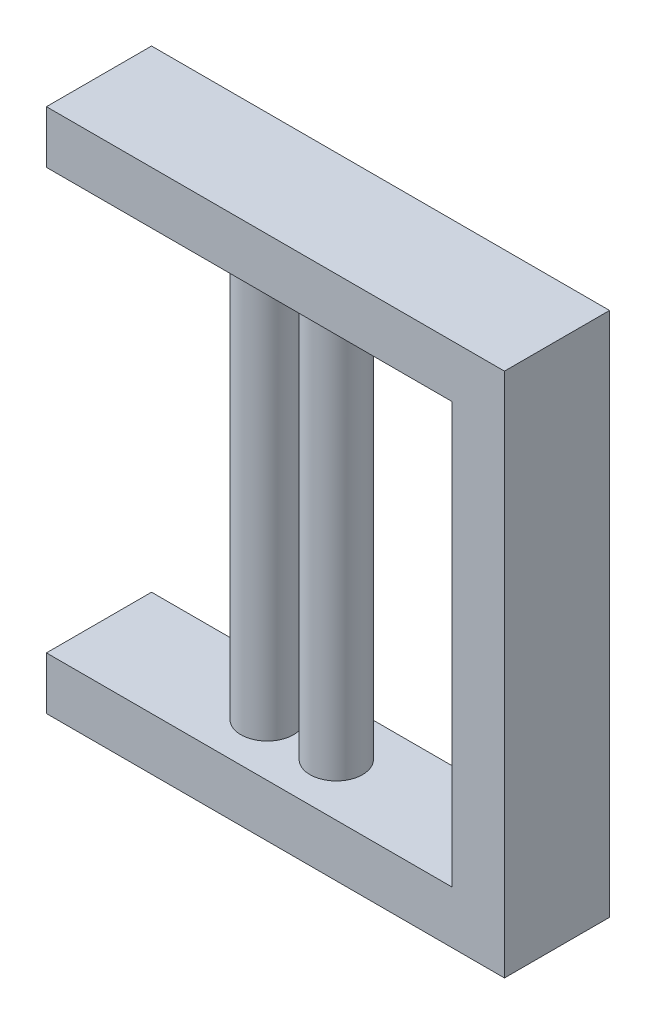
ISO-10303-21;
HEADER;
FILE_DESCRIPTION(('STEP AP214'),'2;1');
FILE_NAME('part.step','',(''),(''),'','','');
FILE_SCHEMA(('AUTOMOTIVE_DESIGN { 1 0 10303 214 1 1 1 1 }'));
ENDSEC;
DATA;
#1=APPLICATION_CONTEXT('core data for automotive mechanical design processes');
#2=APPLICATION_PROTOCOL_DEFINITION('international standard','automotive_design',2000,#1);
#3=PRODUCT_CONTEXT('',#1,'mechanical');
#4=PRODUCT('Part','Part','',(#3));
#5=PRODUCT_RELATED_PRODUCT_CATEGORY('part','',(#4));
#6=PRODUCT_DEFINITION_FORMATION('','',#4);
#7=PRODUCT_DEFINITION_CONTEXT('part definition',#1,'design');
#8=PRODUCT_DEFINITION('design','',#6,#7);
#9=PRODUCT_DEFINITION_SHAPE('','',#8);
#10=(LENGTH_UNIT() NAMED_UNIT(*) SI_UNIT(.MILLI.,.METRE.));
#11=(NAMED_UNIT(*) PLANE_ANGLE_UNIT() SI_UNIT($,.RADIAN.));
#12=(NAMED_UNIT(*) SI_UNIT($,.STERADIAN.) SOLID_ANGLE_UNIT());
#13=UNCERTAINTY_MEASURE_WITH_UNIT(LENGTH_MEASURE(1.E-05),#10,'distance_accuracy_value','');
#14=(GEOMETRIC_REPRESENTATION_CONTEXT(3) GLOBAL_UNCERTAINTY_ASSIGNED_CONTEXT((#13)) GLOBAL_UNIT_ASSIGNED_CONTEXT((#10,
#11,#12)) REPRESENTATION_CONTEXT('',''));
#15=CARTESIAN_POINT('',(0.,0.,0.));
#16=DIRECTION('',(0.,0.,1.));
#17=DIRECTION('',(1.,0.,0.));
#18=AXIS2_PLACEMENT_3D('',#15,#16,#17);
#19=CARTESIAN_POINT('',(97.9800475059383,101.6,25.4));
#20=DIRECTION('',(0.,1.,0.));
#21=DIRECTION('',(0.,0.,1.));
#22=AXIS2_PLACEMENT_3D('',#19,#20,#21);
#23=PLANE('',#22);
#24=CARTESIAN_POINT('',(40.6400277529691,101.6,12.7));
#25=DIRECTION('',(0.,1.,0.));
#26=DIRECTION('',(0.,0.,1.));
#27=AXIS2_PLACEMENT_3D('',#24,#25,#26);
#28=CIRCLE('',#27,6.35);
#29=CARTESIAN_POINT('',(40.6400277529691,101.6,19.05));
#30=VERTEX_POINT('',#29);
#31=EDGE_CURVE('E165',#30,#30,#28,.F.);
#32=ORIENTED_EDGE('',*,*,#31,.F.);
#33=EDGE_LOOP('',(#32));
#34=FACE_BOUND('',#33,.T.);
#35=DIRECTION('',(1.,0.,0.));
#36=VECTOR('',#35,1.);
#37=CARTESIAN_POINT('',(97.9800475059383,101.6,0.));
#38=LINE('',#37,#36);
#39=CARTESIAN_POINT('',(0.,101.6,0.));
#40=VERTEX_POINT('',#39);
#41=CARTESIAN_POINT('',(97.9800475059383,101.6,0.));
#42=VERTEX_POINT('',#41);
#43=EDGE_CURVE('E123',#40,#42,#38,.T.);
#44=ORIENTED_EDGE('',*,*,#43,.T.);
#45=DIRECTION('',(0.,0.,-1.));
#46=VECTOR('',#45,1.);
#47=CARTESIAN_POINT('',(97.9800475059383,101.6,25.4));
#48=LINE('',#47,#46);
#49=CARTESIAN_POINT('',(97.9800475059383,101.6,25.4));
#50=VERTEX_POINT('',#49);
#51=EDGE_CURVE('E120',#50,#42,#48,.T.);
#52=ORIENTED_EDGE('',*,*,#51,.F.);
#53=DIRECTION('',(1.,0.,0.));
#54=VECTOR('',#53,1.);
#55=CARTESIAN_POINT('',(97.9800475059383,101.6,25.4));
#56=LINE('',#55,#54);
#57=CARTESIAN_POINT('',(0.,101.6,25.4));
#58=VERTEX_POINT('',#57);
#59=EDGE_CURVE('E109',#58,#50,#56,.T.);
#60=ORIENTED_EDGE('',*,*,#59,.F.);
#61=DIRECTION('',(0.,0.,-1.));
#62=VECTOR('',#61,1.);
#63=CARTESIAN_POINT('',(0.,101.6,25.4));
#64=LINE('',#63,#62);
#65=EDGE_CURVE('E124',#58,#40,#64,.T.);
#66=ORIENTED_EDGE('',*,*,#65,.T.);
#67=EDGE_LOOP('',(#44,#52,#60,#66));
#68=FACE_BOUND('',#67,.T.);
#69=CARTESIAN_POINT('',(57.3400197529691,101.6,12.7));
#70=DIRECTION('',(0.,1.,0.));
#71=DIRECTION('',(0.,0.,1.));
#72=AXIS2_PLACEMENT_3D('',#69,#70,#71);
#73=CIRCLE('',#72,6.35000000000001);
#74=CARTESIAN_POINT('',(57.3400197529691,101.6,19.05));
#75=VERTEX_POINT('',#74);
#76=EDGE_CURVE('E11',#75,#75,#73,.F.);
#77=ORIENTED_EDGE('',*,*,#76,.F.);
#78=EDGE_LOOP('',(#77));
#79=FACE_BOUND('',#78,.T.);
#80=ADVANCED_FACE('F35',(#34,#68,#79),#23,.F.);
#81=CARTESIAN_POINT('',(0.,0.,25.4));
#82=DIRECTION('',(0.,-1.,0.));
#83=DIRECTION('',(0.,0.,-1.));
#84=AXIS2_PLACEMENT_3D('',#81,#82,#83);
#85=PLANE('',#84);
#86=CARTESIAN_POINT('',(40.6400277529691,0.,12.7));
#87=DIRECTION('',(0.,-1.,0.));
#88=DIRECTION('',(0.,0.,-1.));
#89=AXIS2_PLACEMENT_3D('',#86,#87,#88);
#90=CIRCLE('',#89,6.35);
#91=CARTESIAN_POINT('',(40.6400277529691,0.,6.35000000000001));
#92=VERTEX_POINT('',#91);
#93=EDGE_CURVE('E162',#92,#92,#90,.F.);
#94=ORIENTED_EDGE('',*,*,#93,.F.);
#95=EDGE_LOOP('',(#94));
#96=FACE_BOUND('',#95,.T.);
#97=DIRECTION('',(-1.,0.,0.));
#98=VECTOR('',#97,1.);
#99=CARTESIAN_POINT('',(0.,0.,0.));
#100=LINE('',#99,#98);
#101=CARTESIAN_POINT('',(97.9800475059383,0.,0.));
#102=VERTEX_POINT('',#101);
#103=CARTESIAN_POINT('',(0.,0.,0.));
#104=VERTEX_POINT('',#103);
#105=EDGE_CURVE('E87',#102,#104,#100,.T.);
#106=ORIENTED_EDGE('',*,*,#105,.T.);
#107=DIRECTION('',(0.,0.,-1.));
#108=VECTOR('',#107,1.);
#109=CARTESIAN_POINT('',(0.,0.,25.4));
#110=LINE('',#109,#108);
#111=CARTESIAN_POINT('',(0.,0.,25.4));
#112=VERTEX_POINT('',#111);
#113=EDGE_CURVE('E129',#112,#104,#110,.T.);
#114=ORIENTED_EDGE('',*,*,#113,.F.);
#115=DIRECTION('',(-1.,0.,0.));
#116=VECTOR('',#115,1.);
#117=CARTESIAN_POINT('',(0.,0.,25.4));
#118=LINE('',#117,#116);
#119=CARTESIAN_POINT('',(97.9800475059383,0.,25.4));
#120=VERTEX_POINT('',#119);
#121=EDGE_CURVE('E52',#120,#112,#118,.T.);
#122=ORIENTED_EDGE('',*,*,#121,.F.);
#123=DIRECTION('',(0.,0.,-1.));
#124=VECTOR('',#123,1.);
#125=CARTESIAN_POINT('',(97.9800475059383,0.,25.4));
#126=LINE('',#125,#124);
#127=EDGE_CURVE('E125',#120,#102,#126,.T.);
#128=ORIENTED_EDGE('',*,*,#127,.T.);
#129=EDGE_LOOP('',(#106,#114,#122,#128));
#130=FACE_BOUND('',#129,.T.);
#131=CARTESIAN_POINT('',(57.3400197529691,0.,12.7));
#132=DIRECTION('',(0.,-1.,0.));
#133=DIRECTION('',(0.,0.,-1.));
#134=AXIS2_PLACEMENT_3D('',#131,#132,#133);
#135=CIRCLE('',#134,6.35000000000001);
#136=CARTESIAN_POINT('',(57.3400197529691,0.,6.35));
#137=VERTEX_POINT('',#136);
#138=EDGE_CURVE('E44',#137,#137,#135,.F.);
#139=ORIENTED_EDGE('',*,*,#138,.F.);
#140=EDGE_LOOP('',(#139));
#141=FACE_BOUND('',#140,.T.);
#142=ADVANCED_FACE('F172',(#96,#130,#141),#85,.F.);
#143=CARTESIAN_POINT('',(0.,-12.7,25.4));
#144=DIRECTION('',(1.,0.,0.));
#145=DIRECTION('',(0.,0.,-1.));
#146=AXIS2_PLACEMENT_3D('',#143,#144,#145);
#147=PLANE('',#146);
#148=DIRECTION('',(0.,-1.,0.));
#149=VECTOR('',#148,1.);
#150=CARTESIAN_POINT('',(0.,-12.7,0.));
#151=LINE('',#150,#149);
#152=CARTESIAN_POINT('',(0.,-12.7,0.));
#153=VERTEX_POINT('',#152);
#154=EDGE_CURVE('E133',#104,#153,#151,.T.);
#155=ORIENTED_EDGE('',*,*,#154,.T.);
#156=DIRECTION('',(0.,0.,-1.));
#157=VECTOR('',#156,1.);
#158=CARTESIAN_POINT('',(0.,-12.7,25.4));
#159=LINE('',#158,#157);
#160=CARTESIAN_POINT('',(0.,-12.7,25.4));
#161=VERTEX_POINT('',#160);
#162=EDGE_CURVE('E160',#161,#153,#159,.T.);
#163=ORIENTED_EDGE('',*,*,#162,.F.);
#164=DIRECTION('',(0.,-1.,0.));
#165=VECTOR('',#164,1.);
#166=CARTESIAN_POINT('',(0.,-12.7,25.4));
#167=LINE('',#166,#165);
#168=EDGE_CURVE('E147',#112,#161,#167,.T.);
#169=ORIENTED_EDGE('',*,*,#168,.F.);
#170=ORIENTED_EDGE('',*,*,#113,.T.);
#171=EDGE_LOOP('',(#155,#163,#169,#170));
#172=FACE_BOUND('',#171,.T.);
#173=ADVANCED_FACE('F37',(#172),#147,.F.);
#174=CARTESIAN_POINT('',(110.680047505938,-12.7,25.4));
#175=DIRECTION('',(0.,1.,0.));
#176=DIRECTION('',(-1.,0.,0.));
#177=AXIS2_PLACEMENT_3D('',#174,#175,#176);
#178=PLANE('',#177);
#179=DIRECTION('',(1.,0.,0.));
#180=VECTOR('',#179,1.);
#181=CARTESIAN_POINT('',(110.680047505938,-12.7,0.));
#182=LINE('',#181,#180);
#183=CARTESIAN_POINT('',(110.680047505938,-12.7,0.));
#184=VERTEX_POINT('',#183);
#185=EDGE_CURVE('E136',#153,#184,#182,.T.);
#186=ORIENTED_EDGE('',*,*,#185,.T.);
#187=DIRECTION('',(0.,0.,-1.));
#188=VECTOR('',#187,1.);
#189=CARTESIAN_POINT('',(110.680047505938,-12.7,25.4));
#190=LINE('',#189,#188);
#191=CARTESIAN_POINT('',(110.680047505938,-12.7,25.4));
#192=VERTEX_POINT('',#191);
#193=EDGE_CURVE('E157',#192,#184,#190,.T.);
#194=ORIENTED_EDGE('',*,*,#193,.F.);
#195=DIRECTION('',(1.,0.,0.));
#196=VECTOR('',#195,1.);
#197=CARTESIAN_POINT('',(110.680047505938,-12.7,25.4));
#198=LINE('',#197,#196);
#199=EDGE_CURVE('E96',#161,#192,#198,.T.);
#200=ORIENTED_EDGE('',*,*,#199,.F.);
#201=ORIENTED_EDGE('',*,*,#162,.T.);
#202=EDGE_LOOP('',(#186,#194,#200,#201));
#203=FACE_BOUND('',#202,.T.);
#204=ADVANCED_FACE('F180',(#203),#178,.F.);
#205=CARTESIAN_POINT('',(110.680047505938,114.3,25.4));
#206=DIRECTION('',(-1.,0.,0.));
#207=DIRECTION('',(0.,-1.,0.));
#208=AXIS2_PLACEMENT_3D('',#205,#206,#207);
#209=PLANE('',#208);
#210=DIRECTION('',(0.,1.,0.));
#211=VECTOR('',#210,1.);
#212=CARTESIAN_POINT('',(110.680047505938,114.3,0.));
#213=LINE('',#212,#211);
#214=CARTESIAN_POINT('',(110.680047505938,114.3,0.));
#215=VERTEX_POINT('',#214);
#216=EDGE_CURVE('E138',#184,#215,#213,.T.);
#217=ORIENTED_EDGE('',*,*,#216,.T.);
#218=DIRECTION('',(0.,0.,-1.));
#219=VECTOR('',#218,1.);
#220=CARTESIAN_POINT('',(110.680047505938,114.3,25.4));
#221=LINE('',#220,#219);
#222=CARTESIAN_POINT('',(110.680047505938,114.3,25.4));
#223=VERTEX_POINT('',#222);
#224=EDGE_CURVE('E154',#223,#215,#221,.T.);
#225=ORIENTED_EDGE('',*,*,#224,.F.);
#226=DIRECTION('',(0.,1.,0.));
#227=VECTOR('',#226,1.);
#228=CARTESIAN_POINT('',(110.680047505938,114.3,25.4));
#229=LINE('',#228,#227);
#230=EDGE_CURVE('E211',#192,#223,#229,.T.);
#231=ORIENTED_EDGE('',*,*,#230,.F.);
#232=ORIENTED_EDGE('',*,*,#193,.T.);
#233=EDGE_LOOP('',(#217,#225,#231,#232));
#234=FACE_BOUND('',#233,.T.);
#235=ADVANCED_FACE('F198',(#234),#209,.F.);
#236=CARTESIAN_POINT('',(0.,114.3,25.4));
#237=DIRECTION('',(0.,-1.,0.));
#238=DIRECTION('',(0.,0.,-1.));
#239=AXIS2_PLACEMENT_3D('',#236,#237,#238);
#240=PLANE('',#239);
#241=DIRECTION('',(-1.,0.,0.));
#242=VECTOR('',#241,1.);
#243=CARTESIAN_POINT('',(0.,114.3,0.));
#244=LINE('',#243,#242);
#245=CARTESIAN_POINT('',(0.,114.3,0.));
#246=VERTEX_POINT('',#245);
#247=EDGE_CURVE('E140',#215,#246,#244,.T.);
#248=ORIENTED_EDGE('',*,*,#247,.T.);
#249=DIRECTION('',(0.,0.,-1.));
#250=VECTOR('',#249,1.);
#251=CARTESIAN_POINT('',(0.,114.3,25.4));
#252=LINE('',#251,#250);
#253=CARTESIAN_POINT('',(0.,114.3,25.4));
#254=VERTEX_POINT('',#253);
#255=EDGE_CURVE('E151',#254,#246,#252,.T.);
#256=ORIENTED_EDGE('',*,*,#255,.F.);
#257=DIRECTION('',(-1.,0.,0.));
#258=VECTOR('',#257,1.);
#259=CARTESIAN_POINT('',(0.,114.3,25.4));
#260=LINE('',#259,#258);
#261=EDGE_CURVE('E216',#223,#254,#260,.T.);
#262=ORIENTED_EDGE('',*,*,#261,.F.);
#263=ORIENTED_EDGE('',*,*,#224,.T.);
#264=EDGE_LOOP('',(#248,#256,#262,#263));
#265=FACE_BOUND('',#264,.T.);
#266=ADVANCED_FACE('F194',(#265),#240,.F.);
#267=CARTESIAN_POINT('',(0.,101.6,25.4));
#268=DIRECTION('',(1.,0.,0.));
#269=DIRECTION('',(0.,0.,-1.));
#270=AXIS2_PLACEMENT_3D('',#267,#268,#269);
#271=PLANE('',#270);
#272=DIRECTION('',(0.,-1.,0.));
#273=VECTOR('',#272,1.);
#274=CARTESIAN_POINT('',(0.,101.6,0.));
#275=LINE('',#274,#273);
#276=EDGE_CURVE('E142',#246,#40,#275,.T.);
#277=ORIENTED_EDGE('',*,*,#276,.T.);
#278=ORIENTED_EDGE('',*,*,#65,.F.);
#279=DIRECTION('',(0.,-1.,0.));
#280=VECTOR('',#279,1.);
#281=CARTESIAN_POINT('',(0.,101.6,25.4));
#282=LINE('',#281,#280);
#283=EDGE_CURVE('E115',#254,#58,#282,.T.);
#284=ORIENTED_EDGE('',*,*,#283,.F.);
#285=ORIENTED_EDGE('',*,*,#255,.T.);
#286=EDGE_LOOP('',(#277,#278,#284,#285));
#287=FACE_BOUND('',#286,.T.);
#288=ADVANCED_FACE('F190',(#287),#271,.F.);
#289=CARTESIAN_POINT('',(97.9800475059383,0.,25.4));
#290=DIRECTION('',(1.,0.,0.));
#291=DIRECTION('',(0.,0.,-1.));
#292=AXIS2_PLACEMENT_3D('',#289,#290,#291);
#293=PLANE('',#292);
#294=DIRECTION('',(0.,-1.,0.));
#295=VECTOR('',#294,1.);
#296=CARTESIAN_POINT('',(97.9800475059383,0.,0.));
#297=LINE('',#296,#295);
#298=EDGE_CURVE('E81',#42,#102,#297,.T.);
#299=ORIENTED_EDGE('',*,*,#298,.T.);
#300=ORIENTED_EDGE('',*,*,#127,.F.);
#301=DIRECTION('',(0.,-1.,0.));
#302=VECTOR('',#301,1.);
#303=CARTESIAN_POINT('',(97.9800475059383,0.,25.4));
#304=LINE('',#303,#302);
#305=EDGE_CURVE('E113',#50,#120,#304,.T.);
#306=ORIENTED_EDGE('',*,*,#305,.F.);
#307=ORIENTED_EDGE('',*,*,#51,.T.);
#308=EDGE_LOOP('',(#299,#300,#306,#307));
#309=FACE_BOUND('',#308,.T.);
#310=ADVANCED_FACE('F127',(#309),#293,.F.);
#311=CARTESIAN_POINT('',(0.,0.,25.4));
#312=DIRECTION('',(0.,0.,-1.));
#313=DIRECTION('',(-1.,0.,0.));
#314=AXIS2_PLACEMENT_3D('',#311,#312,#313);
#315=PLANE('',#314);
#316=ORIENTED_EDGE('',*,*,#168,.T.);
#317=ORIENTED_EDGE('',*,*,#199,.T.);
#318=ORIENTED_EDGE('',*,*,#230,.T.);
#319=ORIENTED_EDGE('',*,*,#261,.T.);
#320=ORIENTED_EDGE('',*,*,#283,.T.);
#321=ORIENTED_EDGE('',*,*,#59,.T.);
#322=ORIENTED_EDGE('',*,*,#305,.T.);
#323=ORIENTED_EDGE('',*,*,#121,.T.);
#324=EDGE_LOOP('',(#316,#317,#318,#319,#320,#321,#322,#323));
#325=FACE_BOUND('',#324,.T.);
#326=ADVANCED_FACE('F111',(#325),#315,.F.);
#327=CARTESIAN_POINT('',(0.,0.,0.));
#328=DIRECTION('',(0.,0.,-1.));
#329=DIRECTION('',(-1.,0.,0.));
#330=AXIS2_PLACEMENT_3D('',#327,#328,#329);
#331=PLANE('',#330);
#332=ORIENTED_EDGE('',*,*,#154,.F.);
#333=ORIENTED_EDGE('',*,*,#105,.F.);
#334=ORIENTED_EDGE('',*,*,#298,.F.);
#335=ORIENTED_EDGE('',*,*,#43,.F.);
#336=ORIENTED_EDGE('',*,*,#276,.F.);
#337=ORIENTED_EDGE('',*,*,#247,.F.);
#338=ORIENTED_EDGE('',*,*,#216,.F.);
#339=ORIENTED_EDGE('',*,*,#185,.F.);
#340=EDGE_LOOP('',(#332,#333,#334,#335,#336,#337,#338,#339));
#341=FACE_BOUND('',#340,.T.);
#342=ADVANCED_FACE('F187',(#341),#331,.T.);
#343=CARTESIAN_POINT('',(40.6400277529691,101.6,12.7));
#344=DIRECTION('',(0.,-1.,0.));
#345=DIRECTION('',(0.,0.,-1.));
#346=AXIS2_PLACEMENT_3D('',#343,#344,#345);
#347=CYLINDRICAL_SURFACE('',#346,6.35);
#348=ORIENTED_EDGE('',*,*,#31,.T.);
#349=EDGE_LOOP('',(#348));
#350=FACE_BOUND('',#349,.T.);
#351=ORIENTED_EDGE('',*,*,#93,.T.);
#352=EDGE_LOOP('',(#351));
#353=FACE_BOUND('',#352,.T.);
#354=ADVANCED_FACE('F223',(#350,#353),#347,.T.);
#355=CARTESIAN_POINT('',(57.3400197529691,101.6,12.7));
#356=DIRECTION('',(0.,-1.,0.));
#357=DIRECTION('',(0.,0.,-1.));
#358=AXIS2_PLACEMENT_3D('',#355,#356,#357);
#359=CYLINDRICAL_SURFACE('',#358,6.35000000000001);
#360=ORIENTED_EDGE('',*,*,#76,.T.);
#361=EDGE_LOOP('',(#360));
#362=FACE_BOUND('',#361,.T.);
#363=ORIENTED_EDGE('',*,*,#138,.T.);
#364=EDGE_LOOP('',(#363));
#365=FACE_BOUND('',#364,.T.);
#366=ADVANCED_FACE('F170',(#362,#365),#359,.T.);
#367=CLOSED_SHELL('',(#80,#142,#173,#204,#235,#266,#288,#310,#326,#342,#354,#366));
#368=MANIFOLD_SOLID_BREP('B2',#367);
#369=ADVANCED_BREP_SHAPE_REPRESENTATION('',(#18,#368),#14);
#370=SHAPE_DEFINITION_REPRESENTATION(#9,#369);
ENDSEC;
END-ISO-10303-21;
